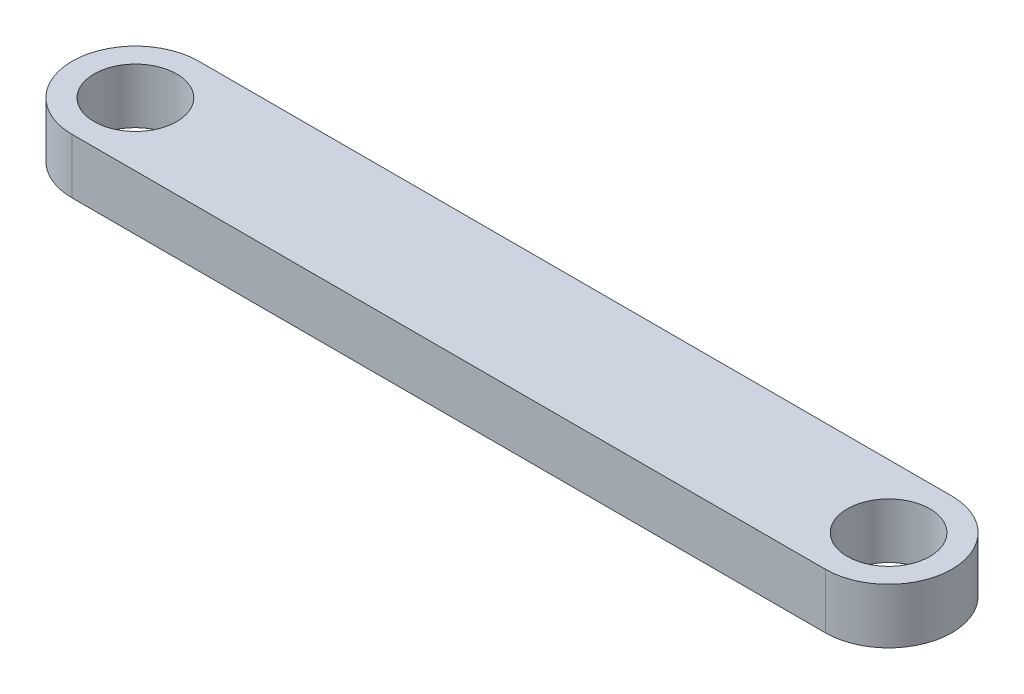
ISO-10303-21;
HEADER;
FILE_DESCRIPTION(('STEP AP214'),'2;1');
FILE_NAME('part.step','',(''),(''),'','','');
FILE_SCHEMA(('AUTOMOTIVE_DESIGN { 1 0 10303 214 1 1 1 1 }'));
ENDSEC;
DATA;
#1=APPLICATION_CONTEXT('core data for automotive mechanical design processes');
#2=APPLICATION_PROTOCOL_DEFINITION('international standard','automotive_design',2000,#1);
#3=PRODUCT_CONTEXT('',#1,'mechanical');
#4=PRODUCT('Part','Part','',(#3));
#5=PRODUCT_RELATED_PRODUCT_CATEGORY('part','',(#4));
#6=PRODUCT_DEFINITION_FORMATION('','',#4);
#7=PRODUCT_DEFINITION_CONTEXT('part definition',#1,'design');
#8=PRODUCT_DEFINITION('design','',#6,#7);
#9=PRODUCT_DEFINITION_SHAPE('','',#8);
#10=(LENGTH_UNIT() NAMED_UNIT(*) SI_UNIT(.MILLI.,.METRE.));
#11=(NAMED_UNIT(*) PLANE_ANGLE_UNIT() SI_UNIT($,.RADIAN.));
#12=(NAMED_UNIT(*) SI_UNIT($,.STERADIAN.) SOLID_ANGLE_UNIT());
#13=UNCERTAINTY_MEASURE_WITH_UNIT(LENGTH_MEASURE(1.E-05),#10,'distance_accuracy_value','');
#14=(GEOMETRIC_REPRESENTATION_CONTEXT(3) GLOBAL_UNCERTAINTY_ASSIGNED_CONTEXT((#13)) GLOBAL_UNIT_ASSIGNED_CONTEXT((#10,
#11,#12)) REPRESENTATION_CONTEXT('',''));
#15=CARTESIAN_POINT('',(0.,0.,0.));
#16=DIRECTION('',(0.,0.,1.));
#17=DIRECTION('',(1.,0.,0.));
#18=AXIS2_PLACEMENT_3D('',#15,#16,#17);
#19=CARTESIAN_POINT('',(0.,5.,5.75));
#20=DIRECTION('',(0.,0.,-1.));
#21=DIRECTION('',(-1.,0.,0.));
#22=AXIS2_PLACEMENT_3D('',#19,#20,#21);
#23=PLANE('',#22);
#24=DIRECTION('',(1.,0.,0.));
#25=VECTOR('',#24,1.);
#26=CARTESIAN_POINT('',(0.,0.,5.75));
#27=LINE('',#26,#25);
#28=CARTESIAN_POINT('',(-34.19,0.,5.75));
#29=VERTEX_POINT('',#28);
#30=CARTESIAN_POINT('',(34.19,0.,5.75));
#31=VERTEX_POINT('',#30);
#32=EDGE_CURVE('E123',#29,#31,#27,.T.);
#33=ORIENTED_EDGE('',*,*,#32,.T.);
#34=DIRECTION('',(0.,-1.,0.));
#35=VECTOR('',#34,1.);
#36=CARTESIAN_POINT('',(34.19,5.,5.75));
#37=LINE('',#36,#35);
#38=CARTESIAN_POINT('',(34.19,5.,5.75));
#39=VERTEX_POINT('',#38);
#40=EDGE_CURVE('E11',#39,#31,#37,.T.);
#41=ORIENTED_EDGE('',*,*,#40,.F.);
#42=DIRECTION('',(1.,0.,0.));
#43=VECTOR('',#42,1.);
#44=CARTESIAN_POINT('',(0.,5.,5.75));
#45=LINE('',#44,#43);
#46=CARTESIAN_POINT('',(-34.19,5.,5.75));
#47=VERTEX_POINT('',#46);
#48=EDGE_CURVE('E96',#47,#39,#45,.T.);
#49=ORIENTED_EDGE('',*,*,#48,.F.);
#50=DIRECTION('',(0.,-1.,0.));
#51=VECTOR('',#50,1.);
#52=CARTESIAN_POINT('',(-34.19,5.,5.75));
#53=LINE('',#52,#51);
#54=EDGE_CURVE('E122',#47,#29,#53,.T.);
#55=ORIENTED_EDGE('',*,*,#54,.T.);
#56=EDGE_LOOP('',(#33,#41,#49,#55));
#57=FACE_BOUND('',#56,.T.);
#58=ADVANCED_FACE('F47',(#57),#23,.F.);
#59=CARTESIAN_POINT('',(34.19,5.,0.));
#60=DIRECTION('',(0.,-1.,0.));
#61=DIRECTION('',(0.,0.,-1.));
#62=AXIS2_PLACEMENT_3D('',#59,#60,#61);
#63=CYLINDRICAL_SURFACE('',#62,5.75);
#64=CARTESIAN_POINT('',(34.19,0.,0.));
#65=DIRECTION('',(0.,1.,0.));
#66=DIRECTION('',(0.,0.,1.));
#67=AXIS2_PLACEMENT_3D('',#64,#65,#66);
#68=CIRCLE('',#67,5.75);
#69=CARTESIAN_POINT('',(34.19,0.,-5.75));
#70=VERTEX_POINT('',#69);
#71=EDGE_CURVE('E102',#31,#70,#68,.T.);
#72=ORIENTED_EDGE('',*,*,#71,.T.);
#73=DIRECTION('',(0.,-1.,0.));
#74=VECTOR('',#73,1.);
#75=CARTESIAN_POINT('',(34.19,5.,-5.75));
#76=LINE('',#75,#74);
#77=CARTESIAN_POINT('',(34.19,5.,-5.75));
#78=VERTEX_POINT('',#77);
#79=EDGE_CURVE('E56',#78,#70,#76,.T.);
#80=ORIENTED_EDGE('',*,*,#79,.F.);
#81=CARTESIAN_POINT('',(34.19,5.,0.));
#82=DIRECTION('',(0.,1.,0.));
#83=DIRECTION('',(0.,0.,1.));
#84=AXIS2_PLACEMENT_3D('',#81,#82,#83);
#85=CIRCLE('',#84,5.75);
#86=EDGE_CURVE('E90',#39,#78,#85,.T.);
#87=ORIENTED_EDGE('',*,*,#86,.F.);
#88=ORIENTED_EDGE('',*,*,#40,.T.);
#89=EDGE_LOOP('',(#72,#80,#87,#88));
#90=FACE_BOUND('',#89,.T.);
#91=ADVANCED_FACE('F101',(#90),#63,.T.);
#92=CARTESIAN_POINT('',(0.,5.,-5.75));
#93=DIRECTION('',(0.,0.,-1.));
#94=DIRECTION('',(-1.,0.,0.));
#95=AXIS2_PLACEMENT_3D('',#92,#93,#94);
#96=PLANE('',#95);
#97=DIRECTION('',(1.,0.,0.));
#98=VECTOR('',#97,1.);
#99=CARTESIAN_POINT('',(0.,0.,-5.75));
#100=LINE('',#99,#98);
#101=CARTESIAN_POINT('',(-34.19,0.,-5.75));
#102=VERTEX_POINT('',#101);
#103=EDGE_CURVE('E129',#102,#70,#100,.T.);
#104=ORIENTED_EDGE('',*,*,#103,.F.);
#105=DIRECTION('',(0.,-1.,0.));
#106=VECTOR('',#105,1.);
#107=CARTESIAN_POINT('',(-34.19,5.,-5.75));
#108=LINE('',#107,#106);
#109=CARTESIAN_POINT('',(-34.19,5.,-5.75));
#110=VERTEX_POINT('',#109);
#111=EDGE_CURVE('E80',#110,#102,#108,.T.);
#112=ORIENTED_EDGE('',*,*,#111,.F.);
#113=DIRECTION('',(1.,0.,0.));
#114=VECTOR('',#113,1.);
#115=CARTESIAN_POINT('',(0.,5.,-5.75));
#116=LINE('',#115,#114);
#117=EDGE_CURVE('E94',#110,#78,#116,.T.);
#118=ORIENTED_EDGE('',*,*,#117,.T.);
#119=ORIENTED_EDGE('',*,*,#79,.T.);
#120=EDGE_LOOP('',(#104,#112,#118,#119));
#121=FACE_BOUND('',#120,.T.);
#122=ADVANCED_FACE('F107',(#121),#96,.T.);
#123=CARTESIAN_POINT('',(-34.19,5.,0.));
#124=DIRECTION('',(0.,-1.,0.));
#125=DIRECTION('',(0.,0.,-1.));
#126=AXIS2_PLACEMENT_3D('',#123,#124,#125);
#127=CYLINDRICAL_SURFACE('',#126,3.75);
#128=CARTESIAN_POINT('',(-34.19,5.,0.));
#129=DIRECTION('',(0.,1.,0.));
#130=DIRECTION('',(0.,0.,1.));
#131=AXIS2_PLACEMENT_3D('',#128,#129,#130);
#132=CIRCLE('',#131,3.75);
#133=CARTESIAN_POINT('',(-34.19,5.,3.75));
#134=VERTEX_POINT('',#133);
#135=EDGE_CURVE('E111',#134,#134,#132,.T.);
#136=ORIENTED_EDGE('',*,*,#135,.T.);
#137=EDGE_LOOP('',(#136));
#138=FACE_BOUND('',#137,.T.);
#139=CARTESIAN_POINT('',(-34.19,0.,0.));
#140=DIRECTION('',(0.,1.,0.));
#141=DIRECTION('',(0.,0.,1.));
#142=AXIS2_PLACEMENT_3D('',#139,#140,#141);
#143=CIRCLE('',#142,3.75);
#144=CARTESIAN_POINT('',(-34.19,0.,3.75));
#145=VERTEX_POINT('',#144);
#146=EDGE_CURVE('E134',#145,#145,#143,.T.);
#147=ORIENTED_EDGE('',*,*,#146,.F.);
#148=EDGE_LOOP('',(#147));
#149=FACE_BOUND('',#148,.T.);
#150=ADVANCED_FACE('F166',(#138,#149),#127,.F.);
#151=CARTESIAN_POINT('',(-34.19,5.,0.));
#152=DIRECTION('',(0.,-1.,0.));
#153=DIRECTION('',(0.,0.,-1.));
#154=AXIS2_PLACEMENT_3D('',#151,#152,#153);
#155=CYLINDRICAL_SURFACE('',#154,5.75);
#156=CARTESIAN_POINT('',(-34.19,0.,0.));
#157=DIRECTION('',(0.,1.,0.));
#158=DIRECTION('',(0.,0.,1.));
#159=AXIS2_PLACEMENT_3D('',#156,#157,#158);
#160=CIRCLE('',#159,5.75);
#161=EDGE_CURVE('E83',#102,#29,#160,.T.);
#162=ORIENTED_EDGE('',*,*,#161,.T.);
#163=ORIENTED_EDGE('',*,*,#54,.F.);
#164=CARTESIAN_POINT('',(-34.19,5.,0.));
#165=DIRECTION('',(0.,1.,0.));
#166=DIRECTION('',(0.,0.,1.));
#167=AXIS2_PLACEMENT_3D('',#164,#165,#166);
#168=CIRCLE('',#167,5.75);
#169=EDGE_CURVE('E64',#110,#47,#168,.T.);
#170=ORIENTED_EDGE('',*,*,#169,.F.);
#171=ORIENTED_EDGE('',*,*,#111,.T.);
#172=EDGE_LOOP('',(#162,#163,#170,#171));
#173=FACE_BOUND('',#172,.T.);
#174=ADVANCED_FACE('F158',(#173),#155,.T.);
#175=CARTESIAN_POINT('',(34.19,5.,0.));
#176=DIRECTION('',(0.,-1.,0.));
#177=DIRECTION('',(0.,0.,-1.));
#178=AXIS2_PLACEMENT_3D('',#175,#176,#177);
#179=CYLINDRICAL_SURFACE('',#178,3.75000000000001);
#180=CARTESIAN_POINT('',(34.19,5.,0.));
#181=DIRECTION('',(0.,1.,0.));
#182=DIRECTION('',(0.,0.,1.));
#183=AXIS2_PLACEMENT_3D('',#180,#181,#182);
#184=CIRCLE('',#183,3.75000000000001);
#185=CARTESIAN_POINT('',(34.19,5.,3.75000000000001));
#186=VERTEX_POINT('',#185);
#187=EDGE_CURVE('E118',#186,#186,#184,.T.);
#188=ORIENTED_EDGE('',*,*,#187,.T.);
#189=EDGE_LOOP('',(#188));
#190=FACE_BOUND('',#189,.T.);
#191=CARTESIAN_POINT('',(34.19,0.,0.));
#192=DIRECTION('',(0.,1.,0.));
#193=DIRECTION('',(0.,0.,1.));
#194=AXIS2_PLACEMENT_3D('',#191,#192,#193);
#195=CIRCLE('',#194,3.75000000000001);
#196=CARTESIAN_POINT('',(34.19,0.,3.75000000000001));
#197=VERTEX_POINT('',#196);
#198=EDGE_CURVE('E138',#197,#197,#195,.T.);
#199=ORIENTED_EDGE('',*,*,#198,.F.);
#200=EDGE_LOOP('',(#199));
#201=FACE_BOUND('',#200,.T.);
#202=ADVANCED_FACE('F156',(#190,#201),#179,.F.);
#203=CARTESIAN_POINT('',(0.,5.,0.));
#204=DIRECTION('',(0.,1.,0.));
#205=DIRECTION('',(0.,0.,1.));
#206=AXIS2_PLACEMENT_3D('',#203,#204,#205);
#207=PLANE('',#206);
#208=ORIENTED_EDGE('',*,*,#48,.T.);
#209=ORIENTED_EDGE('',*,*,#86,.T.);
#210=ORIENTED_EDGE('',*,*,#117,.F.);
#211=ORIENTED_EDGE('',*,*,#169,.T.);
#212=EDGE_LOOP('',(#208,#209,#210,#211));
#213=FACE_BOUND('',#212,.T.);
#214=ORIENTED_EDGE('',*,*,#135,.F.);
#215=EDGE_LOOP('',(#214));
#216=FACE_BOUND('',#215,.T.);
#217=ORIENTED_EDGE('',*,*,#187,.F.);
#218=EDGE_LOOP('',(#217));
#219=FACE_BOUND('',#218,.T.);
#220=ADVANCED_FACE('F91',(#213,#216,#219),#207,.T.);
#221=CARTESIAN_POINT('',(0.,0.,0.));
#222=DIRECTION('',(0.,1.,0.));
#223=DIRECTION('',(0.,0.,1.));
#224=AXIS2_PLACEMENT_3D('',#221,#222,#223);
#225=PLANE('',#224);
#226=ORIENTED_EDGE('',*,*,#32,.F.);
#227=ORIENTED_EDGE('',*,*,#161,.F.);
#228=ORIENTED_EDGE('',*,*,#103,.T.);
#229=ORIENTED_EDGE('',*,*,#71,.F.);
#230=EDGE_LOOP('',(#226,#227,#228,#229));
#231=FACE_BOUND('',#230,.T.);
#232=ORIENTED_EDGE('',*,*,#146,.T.);
#233=EDGE_LOOP('',(#232));
#234=FACE_BOUND('',#233,.T.);
#235=ORIENTED_EDGE('',*,*,#198,.T.);
#236=EDGE_LOOP('',(#235));
#237=FACE_BOUND('',#236,.T.);
#238=ADVANCED_FACE('F148',(#231,#234,#237),#225,.F.);
#239=CLOSED_SHELL('',(#58,#91,#122,#150,#174,#202,#220,#238));
#240=MANIFOLD_SOLID_BREP('B2',#239);
#241=ADVANCED_BREP_SHAPE_REPRESENTATION('',(#18,#240),#14);
#242=SHAPE_DEFINITION_REPRESENTATION(#9,#241);
ENDSEC;
END-ISO-10303-21;
